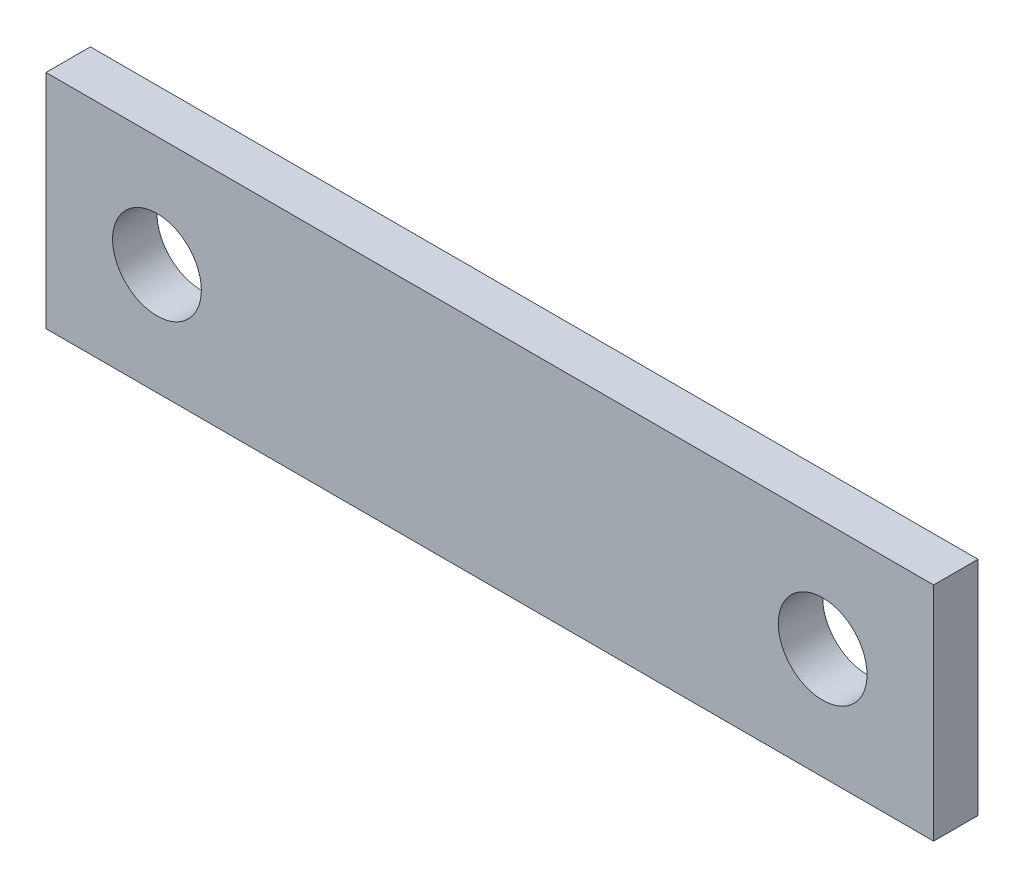
ISO-10303-21;
HEADER;
FILE_DESCRIPTION(('STEP AP214'),'2;1');
FILE_NAME('part.step','',(''),(''),'','','');
FILE_SCHEMA(('AUTOMOTIVE_DESIGN { 1 0 10303 214 1 1 1 1 }'));
ENDSEC;
DATA;
#1=APPLICATION_CONTEXT('core data for automotive mechanical design processes');
#2=APPLICATION_PROTOCOL_DEFINITION('international standard','automotive_design',2000,#1);
#3=PRODUCT_CONTEXT('',#1,'mechanical');
#4=PRODUCT('Part','Part','',(#3));
#5=PRODUCT_RELATED_PRODUCT_CATEGORY('part','',(#4));
#6=PRODUCT_DEFINITION_FORMATION('','',#4);
#7=PRODUCT_DEFINITION_CONTEXT('part definition',#1,'design');
#8=PRODUCT_DEFINITION('design','',#6,#7);
#9=PRODUCT_DEFINITION_SHAPE('','',#8);
#10=(LENGTH_UNIT() NAMED_UNIT(*) SI_UNIT(.MILLI.,.METRE.));
#11=(NAMED_UNIT(*) PLANE_ANGLE_UNIT() SI_UNIT($,.RADIAN.));
#12=(NAMED_UNIT(*) SI_UNIT($,.STERADIAN.) SOLID_ANGLE_UNIT());
#13=UNCERTAINTY_MEASURE_WITH_UNIT(LENGTH_MEASURE(1.E-05),#10,'distance_accuracy_value','');
#14=(GEOMETRIC_REPRESENTATION_CONTEXT(3) GLOBAL_UNCERTAINTY_ASSIGNED_CONTEXT((#13)) GLOBAL_UNIT_ASSIGNED_CONTEXT((#10,
#11,#12)) REPRESENTATION_CONTEXT('',''));
#15=CARTESIAN_POINT('',(0.,0.,0.));
#16=DIRECTION('',(0.,0.,1.));
#17=DIRECTION('',(1.,0.,0.));
#18=AXIS2_PLACEMENT_3D('',#15,#16,#17);
#19=CARTESIAN_POINT('',(0.,0.,6.));
#20=DIRECTION('',(0.,0.,-1.));
#21=DIRECTION('',(-1.,0.,0.));
#22=AXIS2_PLACEMENT_3D('',#19,#20,#21);
#23=PLANE('',#22);
#24=CARTESIAN_POINT('',(15.,15.,6.));
#25=DIRECTION('',(0.,0.,1.));
#26=DIRECTION('',(1.,0.,0.));
#27=AXIS2_PLACEMENT_3D('',#24,#25,#26);
#28=CIRCLE('',#27,6.);
#29=CARTESIAN_POINT('',(21.,15.,6.));
#30=VERTEX_POINT('',#29);
#31=EDGE_CURVE('E99',#30,#30,#28,.T.);
#32=ORIENTED_EDGE('',*,*,#31,.F.);
#33=EDGE_LOOP('',(#32));
#34=FACE_BOUND('',#33,.T.);
#35=DIRECTION('',(0.,-1.,0.));
#36=VECTOR('',#35,1.);
#37=CARTESIAN_POINT('',(0.,0.,6.));
#38=LINE('',#37,#36);
#39=CARTESIAN_POINT('',(0.,30.,6.));
#40=VERTEX_POINT('',#39);
#41=CARTESIAN_POINT('',(0.,0.,6.));
#42=VERTEX_POINT('',#41);
#43=EDGE_CURVE('E84',#40,#42,#38,.T.);
#44=ORIENTED_EDGE('',*,*,#43,.T.);
#45=DIRECTION('',(1.,0.,0.));
#46=VECTOR('',#45,1.);
#47=CARTESIAN_POINT('',(0.,0.,6.));
#48=LINE('',#47,#46);
#49=CARTESIAN_POINT('',(120.,0.,6.));
#50=VERTEX_POINT('',#49);
#51=EDGE_CURVE('E79',#42,#50,#48,.T.);
#52=ORIENTED_EDGE('',*,*,#51,.T.);
#53=DIRECTION('',(0.,1.,0.));
#54=VECTOR('',#53,1.);
#55=CARTESIAN_POINT('',(120.,0.,6.));
#56=LINE('',#55,#54);
#57=CARTESIAN_POINT('',(120.,30.,6.));
#58=VERTEX_POINT('',#57);
#59=EDGE_CURVE('E82',#50,#58,#56,.T.);
#60=ORIENTED_EDGE('',*,*,#59,.T.);
#61=DIRECTION('',(-1.,0.,0.));
#62=VECTOR('',#61,1.);
#63=CARTESIAN_POINT('',(0.,30.,6.));
#64=LINE('',#63,#62);
#65=EDGE_CURVE('E49',#58,#40,#64,.T.);
#66=ORIENTED_EDGE('',*,*,#65,.T.);
#67=EDGE_LOOP('',(#44,#52,#60,#66));
#68=FACE_BOUND('',#67,.T.);
#69=CARTESIAN_POINT('',(105.,15.,6.));
#70=DIRECTION('',(0.,0.,1.));
#71=DIRECTION('',(1.,0.,0.));
#72=AXIS2_PLACEMENT_3D('',#69,#70,#71);
#73=CIRCLE('',#72,6.);
#74=CARTESIAN_POINT('',(111.,15.,6.));
#75=VERTEX_POINT('',#74);
#76=EDGE_CURVE('E114',#75,#75,#73,.T.);
#77=ORIENTED_EDGE('',*,*,#76,.F.);
#78=EDGE_LOOP('',(#77));
#79=FACE_BOUND('',#78,.T.);
#80=ADVANCED_FACE('F32',(#34,#68,#79),#23,.F.);
#81=CARTESIAN_POINT('',(0.,0.,0.));
#82=DIRECTION('',(0.,0.,-1.));
#83=DIRECTION('',(-1.,0.,0.));
#84=AXIS2_PLACEMENT_3D('',#81,#82,#83);
#85=PLANE('',#84);
#86=CARTESIAN_POINT('',(15.,15.,0.));
#87=DIRECTION('',(0.,0.,1.));
#88=DIRECTION('',(1.,0.,0.));
#89=AXIS2_PLACEMENT_3D('',#86,#87,#88);
#90=CIRCLE('',#89,6.);
#91=CARTESIAN_POINT('',(21.,15.,0.));
#92=VERTEX_POINT('',#91);
#93=EDGE_CURVE('E111',#92,#92,#90,.T.);
#94=ORIENTED_EDGE('',*,*,#93,.T.);
#95=EDGE_LOOP('',(#94));
#96=FACE_BOUND('',#95,.T.);
#97=DIRECTION('',(0.,-1.,0.));
#98=VECTOR('',#97,1.);
#99=CARTESIAN_POINT('',(0.,0.,0.));
#100=LINE('',#99,#98);
#101=CARTESIAN_POINT('',(0.,30.,0.));
#102=VERTEX_POINT('',#101);
#103=CARTESIAN_POINT('',(0.,0.,0.));
#104=VERTEX_POINT('',#103);
#105=EDGE_CURVE('E96',#102,#104,#100,.T.);
#106=ORIENTED_EDGE('',*,*,#105,.F.);
#107=DIRECTION('',(-1.,0.,0.));
#108=VECTOR('',#107,1.);
#109=CARTESIAN_POINT('',(0.,30.,0.));
#110=LINE('',#109,#108);
#111=CARTESIAN_POINT('',(120.,30.,0.));
#112=VERTEX_POINT('',#111);
#113=EDGE_CURVE('E72',#112,#102,#110,.T.);
#114=ORIENTED_EDGE('',*,*,#113,.F.);
#115=DIRECTION('',(0.,1.,0.));
#116=VECTOR('',#115,1.);
#117=CARTESIAN_POINT('',(120.,0.,0.));
#118=LINE('',#117,#116);
#119=CARTESIAN_POINT('',(120.,0.,0.));
#120=VERTEX_POINT('',#119);
#121=EDGE_CURVE('E66',#120,#112,#118,.T.);
#122=ORIENTED_EDGE('',*,*,#121,.F.);
#123=DIRECTION('',(1.,0.,0.));
#124=VECTOR('',#123,1.);
#125=CARTESIAN_POINT('',(0.,0.,0.));
#126=LINE('',#125,#124);
#127=EDGE_CURVE('E88',#104,#120,#126,.T.);
#128=ORIENTED_EDGE('',*,*,#127,.F.);
#129=EDGE_LOOP('',(#106,#114,#122,#128));
#130=FACE_BOUND('',#129,.T.);
#131=CARTESIAN_POINT('',(105.,15.,0.));
#132=DIRECTION('',(0.,0.,1.));
#133=DIRECTION('',(1.,0.,0.));
#134=AXIS2_PLACEMENT_3D('',#131,#132,#133);
#135=CIRCLE('',#134,6.);
#136=CARTESIAN_POINT('',(111.,15.,0.));
#137=VERTEX_POINT('',#136);
#138=EDGE_CURVE('E117',#137,#137,#135,.T.);
#139=ORIENTED_EDGE('',*,*,#138,.T.);
#140=EDGE_LOOP('',(#139));
#141=FACE_BOUND('',#140,.T.);
#142=ADVANCED_FACE('F107',(#96,#130,#141),#85,.T.);
#143=CARTESIAN_POINT('',(0.,0.,6.));
#144=DIRECTION('',(1.,0.,0.));
#145=DIRECTION('',(0.,0.,-1.));
#146=AXIS2_PLACEMENT_3D('',#143,#144,#145);
#147=PLANE('',#146);
#148=ORIENTED_EDGE('',*,*,#105,.T.);
#149=DIRECTION('',(0.,0.,-1.));
#150=VECTOR('',#149,1.);
#151=CARTESIAN_POINT('',(0.,0.,6.));
#152=LINE('',#151,#150);
#153=EDGE_CURVE('E11',#42,#104,#152,.T.);
#154=ORIENTED_EDGE('',*,*,#153,.F.);
#155=ORIENTED_EDGE('',*,*,#43,.F.);
#156=DIRECTION('',(0.,0.,-1.));
#157=VECTOR('',#156,1.);
#158=CARTESIAN_POINT('',(0.,30.,6.));
#159=LINE('',#158,#157);
#160=EDGE_CURVE('E92',#40,#102,#159,.T.);
#161=ORIENTED_EDGE('',*,*,#160,.T.);
#162=EDGE_LOOP('',(#148,#154,#155,#161));
#163=FACE_BOUND('',#162,.T.);
#164=ADVANCED_FACE('F34',(#163),#147,.F.);
#165=CARTESIAN_POINT('',(0.,0.,6.));
#166=DIRECTION('',(0.,1.,0.));
#167=DIRECTION('',(0.,0.,1.));
#168=AXIS2_PLACEMENT_3D('',#165,#166,#167);
#169=PLANE('',#168);
#170=ORIENTED_EDGE('',*,*,#127,.T.);
#171=DIRECTION('',(0.,0.,-1.));
#172=VECTOR('',#171,1.);
#173=CARTESIAN_POINT('',(120.,0.,6.));
#174=LINE('',#173,#172);
#175=EDGE_CURVE('E41',#50,#120,#174,.T.);
#176=ORIENTED_EDGE('',*,*,#175,.F.);
#177=ORIENTED_EDGE('',*,*,#51,.F.);
#178=ORIENTED_EDGE('',*,*,#153,.T.);
#179=EDGE_LOOP('',(#170,#176,#177,#178));
#180=FACE_BOUND('',#179,.T.);
#181=ADVANCED_FACE('F87',(#180),#169,.F.);
#182=CARTESIAN_POINT('',(120.,0.,6.));
#183=DIRECTION('',(-1.,0.,0.));
#184=DIRECTION('',(0.,0.,1.));
#185=AXIS2_PLACEMENT_3D('',#182,#183,#184);
#186=PLANE('',#185);
#187=ORIENTED_EDGE('',*,*,#121,.T.);
#188=DIRECTION('',(0.,0.,-1.));
#189=VECTOR('',#188,1.);
#190=CARTESIAN_POINT('',(120.,30.,6.));
#191=LINE('',#190,#189);
#192=EDGE_CURVE('E89',#58,#112,#191,.T.);
#193=ORIENTED_EDGE('',*,*,#192,.F.);
#194=ORIENTED_EDGE('',*,*,#59,.F.);
#195=ORIENTED_EDGE('',*,*,#175,.T.);
#196=EDGE_LOOP('',(#187,#193,#194,#195));
#197=FACE_BOUND('',#196,.T.);
#198=ADVANCED_FACE('F90',(#197),#186,.F.);
#199=CARTESIAN_POINT('',(0.,30.,6.));
#200=DIRECTION('',(0.,-1.,0.));
#201=DIRECTION('',(0.,0.,-1.));
#202=AXIS2_PLACEMENT_3D('',#199,#200,#201);
#203=PLANE('',#202);
#204=ORIENTED_EDGE('',*,*,#113,.T.);
#205=ORIENTED_EDGE('',*,*,#160,.F.);
#206=ORIENTED_EDGE('',*,*,#65,.F.);
#207=ORIENTED_EDGE('',*,*,#192,.T.);
#208=EDGE_LOOP('',(#204,#205,#206,#207));
#209=FACE_BOUND('',#208,.T.);
#210=ADVANCED_FACE('F104',(#209),#203,.F.);
#211=CARTESIAN_POINT('',(15.,15.,6.));
#212=DIRECTION('',(0.,0.,-1.));
#213=DIRECTION('',(-1.,0.,0.));
#214=AXIS2_PLACEMENT_3D('',#211,#212,#213);
#215=CYLINDRICAL_SURFACE('',#214,6.);
#216=ORIENTED_EDGE('',*,*,#31,.T.);
#217=EDGE_LOOP('',(#216));
#218=FACE_BOUND('',#217,.T.);
#219=ORIENTED_EDGE('',*,*,#93,.F.);
#220=EDGE_LOOP('',(#219));
#221=FACE_BOUND('',#220,.T.);
#222=ADVANCED_FACE('F135',(#218,#221),#215,.F.);
#223=CARTESIAN_POINT('',(105.,15.,6.));
#224=DIRECTION('',(0.,0.,-1.));
#225=DIRECTION('',(-1.,0.,0.));
#226=AXIS2_PLACEMENT_3D('',#223,#224,#225);
#227=CYLINDRICAL_SURFACE('',#226,6.);
#228=ORIENTED_EDGE('',*,*,#76,.T.);
#229=EDGE_LOOP('',(#228));
#230=FACE_BOUND('',#229,.T.);
#231=ORIENTED_EDGE('',*,*,#138,.F.);
#232=EDGE_LOOP('',(#231));
#233=FACE_BOUND('',#232,.T.);
#234=ADVANCED_FACE('F123',(#230,#233),#227,.F.);
#235=CLOSED_SHELL('',(#80,#142,#164,#181,#198,#210,#222,#234));
#236=MANIFOLD_SOLID_BREP('B2',#235);
#237=ADVANCED_BREP_SHAPE_REPRESENTATION('',(#18,#236),#14);
#238=SHAPE_DEFINITION_REPRESENTATION(#9,#237);
ENDSEC;
END-ISO-10303-21;
